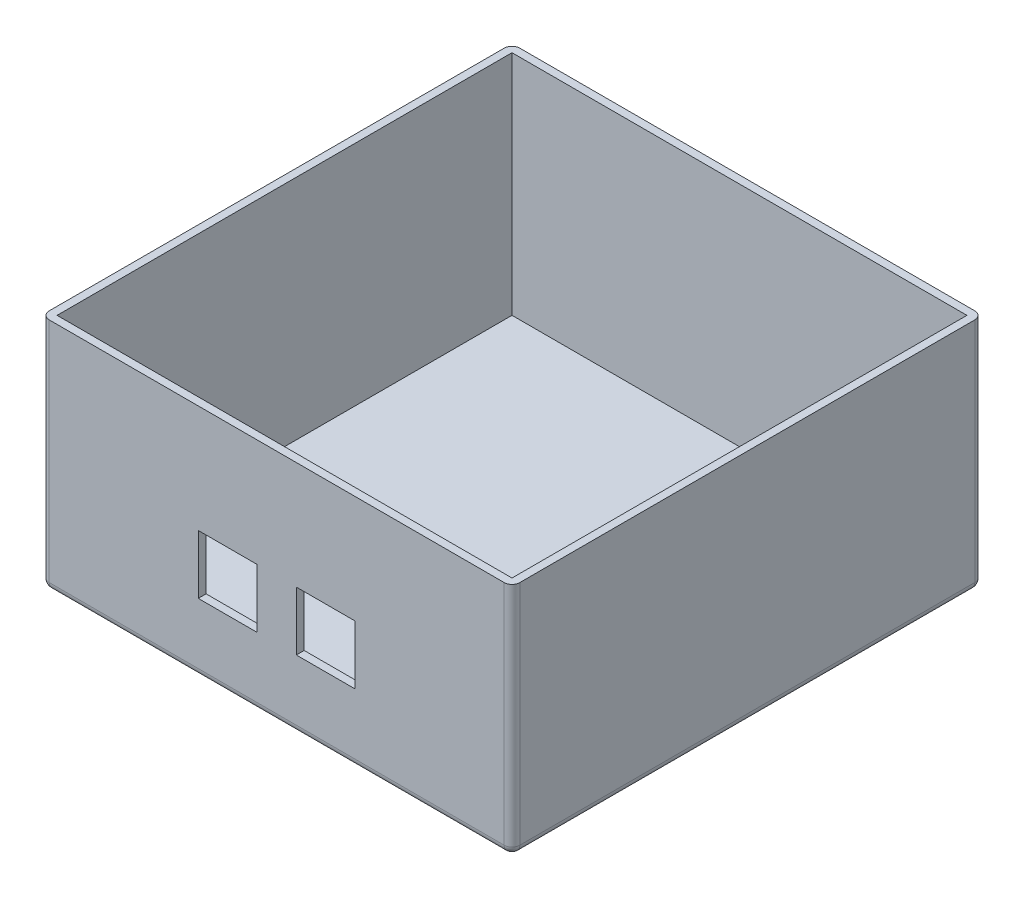
ISO-10303-21;
HEADER;
FILE_DESCRIPTION(('STEP AP214'),'2;1');
FILE_NAME('part.step','',(''),(''),'','','');
FILE_SCHEMA(('AUTOMOTIVE_DESIGN { 1 0 10303 214 1 1 1 1 }'));
ENDSEC;
DATA;
#1=APPLICATION_CONTEXT('core data for automotive mechanical design processes');
#2=APPLICATION_PROTOCOL_DEFINITION('international standard','automotive_design',2000,#1);
#3=PRODUCT_CONTEXT('',#1,'mechanical');
#4=PRODUCT('Part','Part','',(#3));
#5=PRODUCT_RELATED_PRODUCT_CATEGORY('part','',(#4));
#6=PRODUCT_DEFINITION_FORMATION('','',#4);
#7=PRODUCT_DEFINITION_CONTEXT('part definition',#1,'design');
#8=PRODUCT_DEFINITION('design','',#6,#7);
#9=PRODUCT_DEFINITION_SHAPE('','',#8);
#10=(LENGTH_UNIT() NAMED_UNIT(*) SI_UNIT(.MILLI.,.METRE.));
#11=(NAMED_UNIT(*) PLANE_ANGLE_UNIT() SI_UNIT($,.RADIAN.));
#12=(NAMED_UNIT(*) SI_UNIT($,.STERADIAN.) SOLID_ANGLE_UNIT());
#13=UNCERTAINTY_MEASURE_WITH_UNIT(LENGTH_MEASURE(1.E-05),#10,'distance_accuracy_value','');
#14=(GEOMETRIC_REPRESENTATION_CONTEXT(3) GLOBAL_UNCERTAINTY_ASSIGNED_CONTEXT((#13)) GLOBAL_UNIT_ASSIGNED_CONTEXT((#10,
#11,#12)) REPRESENTATION_CONTEXT('',''));
#15=CARTESIAN_POINT('',(0.,0.,0.));
#16=DIRECTION('',(0.,0.,1.));
#17=DIRECTION('',(1.,0.,0.));
#18=AXIS2_PLACEMENT_3D('',#15,#16,#17);
#19=CARTESIAN_POINT('',(0.,60.,0.));
#20=DIRECTION('',(0.,-1.,0.));
#21=DIRECTION('',(0.,0.,-1.));
#22=AXIS2_PLACEMENT_3D('',#19,#20,#21);
#23=PLANE('',#22);
#24=DIRECTION('',(-1.,0.,0.));
#25=VECTOR('',#24,1.);
#26=CARTESIAN_POINT('',(-60.,60.,-60.));
#27=LINE('',#26,#25);
#28=CARTESIAN_POINT('',(58.,60.,-60.));
#29=VERTEX_POINT('',#28);
#30=CARTESIAN_POINT('',(-58.,60.,-60.));
#31=VERTEX_POINT('',#30);
#32=EDGE_CURVE('E293',#29,#31,#27,.T.);
#33=ORIENTED_EDGE('',*,*,#32,.T.);
#34=CARTESIAN_POINT('',(-58.,60.,-58.));
#35=DIRECTION('',(0.,-1.,0.));
#36=DIRECTION('',(0.,0.,-1.));
#37=AXIS2_PLACEMENT_3D('',#34,#35,#36);
#38=CIRCLE('',#37,2.);
#39=CARTESIAN_POINT('',(-60.,60.,-58.));
#40=VERTEX_POINT('',#39);
#41=EDGE_CURVE('E11',#31,#40,#38,.F.);
#42=ORIENTED_EDGE('',*,*,#41,.T.);
#43=DIRECTION('',(0.,0.,1.));
#44=VECTOR('',#43,1.);
#45=CARTESIAN_POINT('',(-60.,60.,60.));
#46=LINE('',#45,#44);
#47=CARTESIAN_POINT('',(-60.,60.,58.));
#48=VERTEX_POINT('',#47);
#49=EDGE_CURVE('E296',#40,#48,#46,.T.);
#50=ORIENTED_EDGE('',*,*,#49,.T.);
#51=CARTESIAN_POINT('',(-58.,60.,58.));
#52=DIRECTION('',(0.,-1.,0.));
#53=DIRECTION('',(0.,0.,-1.));
#54=AXIS2_PLACEMENT_3D('',#51,#52,#53);
#55=CIRCLE('',#54,2.);
#56=CARTESIAN_POINT('',(-58.,60.,60.));
#57=VERTEX_POINT('',#56);
#58=EDGE_CURVE('E336',#48,#57,#55,.F.);
#59=ORIENTED_EDGE('',*,*,#58,.T.);
#60=DIRECTION('',(1.,0.,0.));
#61=VECTOR('',#60,1.);
#62=CARTESIAN_POINT('',(-60.,60.,60.));
#63=LINE('',#62,#61);
#64=CARTESIAN_POINT('',(58.,60.,60.));
#65=VERTEX_POINT('',#64);
#66=EDGE_CURVE('E299',#57,#65,#63,.T.);
#67=ORIENTED_EDGE('',*,*,#66,.T.);
#68=CARTESIAN_POINT('',(58.,60.,58.));
#69=DIRECTION('',(0.,-1.,0.));
#70=DIRECTION('',(0.,0.,-1.));
#71=AXIS2_PLACEMENT_3D('',#68,#69,#70);
#72=CIRCLE('',#71,2.);
#73=CARTESIAN_POINT('',(60.,60.,58.));
#74=VERTEX_POINT('',#73);
#75=EDGE_CURVE('E338',#65,#74,#72,.F.);
#76=ORIENTED_EDGE('',*,*,#75,.T.);
#77=DIRECTION('',(0.,0.,-1.));
#78=VECTOR('',#77,1.);
#79=CARTESIAN_POINT('',(60.,60.,60.));
#80=LINE('',#79,#78);
#81=CARTESIAN_POINT('',(60.,60.,-58.));
#82=VERTEX_POINT('',#81);
#83=EDGE_CURVE('E267',#74,#82,#80,.T.);
#84=ORIENTED_EDGE('',*,*,#83,.T.);
#85=CARTESIAN_POINT('',(58.,60.,-58.));
#86=DIRECTION('',(0.,-1.,0.));
#87=DIRECTION('',(0.,0.,-1.));
#88=AXIS2_PLACEMENT_3D('',#85,#86,#87);
#89=CIRCLE('',#88,2.);
#90=EDGE_CURVE('E48',#82,#29,#89,.F.);
#91=ORIENTED_EDGE('',*,*,#90,.T.);
#92=EDGE_LOOP('',(#33,#42,#50,#59,#67,#76,#84,#91));
#93=FACE_BOUND('',#92,.T.);
#94=DIRECTION('',(0.,0.,-1.));
#95=VECTOR('',#94,1.);
#96=CARTESIAN_POINT('',(58.,60.,0.));
#97=LINE('',#96,#95);
#98=CARTESIAN_POINT('',(58.,60.,58.));
#99=VERTEX_POINT('',#98);
#100=CARTESIAN_POINT('',(58.,60.,-58.));
#101=VERTEX_POINT('',#100);
#102=EDGE_CURVE('E283',#99,#101,#97,.T.);
#103=ORIENTED_EDGE('',*,*,#102,.F.);
#104=DIRECTION('',(1.,0.,0.));
#105=VECTOR('',#104,1.);
#106=CARTESIAN_POINT('',(0.,60.,58.));
#107=LINE('',#106,#105);
#108=CARTESIAN_POINT('',(-58.,60.,58.));
#109=VERTEX_POINT('',#108);
#110=EDGE_CURVE('E273',#109,#99,#107,.T.);
#111=ORIENTED_EDGE('',*,*,#110,.F.);
#112=DIRECTION('',(0.,0.,1.));
#113=VECTOR('',#112,1.);
#114=CARTESIAN_POINT('',(-58.,60.,0.));
#115=LINE('',#114,#113);
#116=CARTESIAN_POINT('',(-58.,60.,-58.));
#117=VERTEX_POINT('',#116);
#118=EDGE_CURVE('E287',#117,#109,#115,.T.);
#119=ORIENTED_EDGE('',*,*,#118,.F.);
#120=DIRECTION('',(-1.,0.,0.));
#121=VECTOR('',#120,1.);
#122=CARTESIAN_POINT('',(0.,60.,-58.));
#123=LINE('',#122,#121);
#124=EDGE_CURVE('E285',#101,#117,#123,.T.);
#125=ORIENTED_EDGE('',*,*,#124,.F.);
#126=EDGE_LOOP('',(#103,#111,#119,#125));
#127=FACE_BOUND('',#126,.T.);
#128=ADVANCED_FACE('F39',(#93,#127),#23,.F.);
#129=CARTESIAN_POINT('',(60.,60.,60.));
#130=DIRECTION('',(-1.,0.,0.));
#131=DIRECTION('',(0.,0.,1.));
#132=AXIS2_PLACEMENT_3D('',#129,#130,#131);
#133=PLANE('',#132);
#134=DIRECTION('',(0.,0.,-1.));
#135=VECTOR('',#134,1.);
#136=CARTESIAN_POINT('',(60.,2.,-60.));
#137=LINE('',#136,#135);
#138=CARTESIAN_POINT('',(60.,2.,58.));
#139=VERTEX_POINT('',#138);
#140=CARTESIAN_POINT('',(60.,2.,-58.));
#141=VERTEX_POINT('',#140);
#142=EDGE_CURVE('E320',#139,#141,#137,.T.);
#143=ORIENTED_EDGE('',*,*,#142,.T.);
#144=DIRECTION('',(0.,-1.,0.));
#145=VECTOR('',#144,1.);
#146=CARTESIAN_POINT('',(60.,60.,-58.));
#147=LINE('',#146,#145);
#148=EDGE_CURVE('E322',#141,#82,#147,.F.);
#149=ORIENTED_EDGE('',*,*,#148,.T.);
#150=ORIENTED_EDGE('',*,*,#83,.F.);
#151=DIRECTION('',(0.,-1.,0.));
#152=VECTOR('',#151,1.);
#153=CARTESIAN_POINT('',(60.,60.,58.));
#154=LINE('',#153,#152);
#155=EDGE_CURVE('E318',#74,#139,#154,.T.);
#156=ORIENTED_EDGE('',*,*,#155,.T.);
#157=EDGE_LOOP('',(#143,#149,#150,#156));
#158=FACE_BOUND('',#157,.T.);
#159=ADVANCED_FACE('F385',(#158),#133,.F.);
#160=CARTESIAN_POINT('',(-60.,60.,-60.));
#161=DIRECTION('',(0.,0.,1.));
#162=DIRECTION('',(1.,0.,0.));
#163=AXIS2_PLACEMENT_3D('',#160,#161,#162);
#164=PLANE('',#163);
#165=DIRECTION('',(-1.,0.,0.));
#166=VECTOR('',#165,1.);
#167=CARTESIAN_POINT('',(-60.,2.,-60.));
#168=LINE('',#167,#166);
#169=CARTESIAN_POINT('',(58.,2.,-60.));
#170=VERTEX_POINT('',#169);
#171=CARTESIAN_POINT('',(-58.,2.,-60.));
#172=VERTEX_POINT('',#171);
#173=EDGE_CURVE('E304',#170,#172,#168,.T.);
#174=ORIENTED_EDGE('',*,*,#173,.T.);
#175=DIRECTION('',(0.,-1.,0.));
#176=VECTOR('',#175,1.);
#177=CARTESIAN_POINT('',(-58.,60.,-60.));
#178=LINE('',#177,#176);
#179=EDGE_CURVE('E307',#172,#31,#178,.F.);
#180=ORIENTED_EDGE('',*,*,#179,.T.);
#181=ORIENTED_EDGE('',*,*,#32,.F.);
#182=DIRECTION('',(0.,-1.,0.));
#183=VECTOR('',#182,1.);
#184=CARTESIAN_POINT('',(58.,60.,-60.));
#185=LINE('',#184,#183);
#186=EDGE_CURVE('E302',#29,#170,#185,.T.);
#187=ORIENTED_EDGE('',*,*,#186,.T.);
#188=EDGE_LOOP('',(#174,#180,#181,#187));
#189=FACE_BOUND('',#188,.T.);
#190=ADVANCED_FACE('F399',(#189),#164,.F.);
#191=CARTESIAN_POINT('',(-60.,60.,60.));
#192=DIRECTION('',(1.,0.,0.));
#193=DIRECTION('',(0.,0.,-1.));
#194=AXIS2_PLACEMENT_3D('',#191,#192,#193);
#195=PLANE('',#194);
#196=ORIENTED_EDGE('',*,*,#49,.F.);
#197=DIRECTION('',(0.,-1.,0.));
#198=VECTOR('',#197,1.);
#199=CARTESIAN_POINT('',(-60.,60.,-58.));
#200=LINE('',#199,#198);
#201=CARTESIAN_POINT('',(-60.,2.,-58.));
#202=VERTEX_POINT('',#201);
#203=EDGE_CURVE('E334',#40,#202,#200,.T.);
#204=ORIENTED_EDGE('',*,*,#203,.T.);
#205=DIRECTION('',(0.,0.,1.));
#206=VECTOR('',#205,1.);
#207=CARTESIAN_POINT('',(-60.,2.,60.));
#208=LINE('',#207,#206);
#209=CARTESIAN_POINT('',(-60.,2.,58.));
#210=VERTEX_POINT('',#209);
#211=EDGE_CURVE('E332',#202,#210,#208,.T.);
#212=ORIENTED_EDGE('',*,*,#211,.T.);
#213=DIRECTION('',(0.,-1.,0.));
#214=VECTOR('',#213,1.);
#215=CARTESIAN_POINT('',(-60.,60.,58.));
#216=LINE('',#215,#214);
#217=EDGE_CURVE('E330',#210,#48,#216,.F.);
#218=ORIENTED_EDGE('',*,*,#217,.T.);
#219=EDGE_LOOP('',(#196,#204,#212,#218));
#220=FACE_BOUND('',#219,.T.);
#221=ADVANCED_FACE('F409',(#220),#195,.F.);
#222=CARTESIAN_POINT('',(-60.,60.,60.));
#223=DIRECTION('',(0.,0.,-1.));
#224=DIRECTION('',(-1.,0.,0.));
#225=AXIS2_PLACEMENT_3D('',#222,#223,#224);
#226=PLANE('',#225);
#227=DIRECTION('',(0.,-1.,0.));
#228=VECTOR('',#227,1.);
#229=CARTESIAN_POINT('',(-20.,17.5,60.));
#230=LINE('',#229,#228);
#231=CARTESIAN_POINT('',(-20.,32.5,60.));
#232=VERTEX_POINT('',#231);
#233=CARTESIAN_POINT('',(-20.,17.5,60.));
#234=VERTEX_POINT('',#233);
#235=EDGE_CURVE('E205',#232,#234,#230,.T.);
#236=ORIENTED_EDGE('',*,*,#235,.F.);
#237=DIRECTION('',(-1.,0.,0.));
#238=VECTOR('',#237,1.);
#239=CARTESIAN_POINT('',(-20.,32.5,60.));
#240=LINE('',#239,#238);
#241=CARTESIAN_POINT('',(-5.,32.5,60.));
#242=VERTEX_POINT('',#241);
#243=EDGE_CURVE('E223',#242,#232,#240,.T.);
#244=ORIENTED_EDGE('',*,*,#243,.F.);
#245=DIRECTION('',(0.,1.,0.));
#246=VECTOR('',#245,1.);
#247=CARTESIAN_POINT('',(-5.,17.5,60.));
#248=LINE('',#247,#246);
#249=CARTESIAN_POINT('',(-5.,17.5,60.));
#250=VERTEX_POINT('',#249);
#251=EDGE_CURVE('E220',#250,#242,#248,.T.);
#252=ORIENTED_EDGE('',*,*,#251,.F.);
#253=DIRECTION('',(1.,0.,0.));
#254=VECTOR('',#253,1.);
#255=CARTESIAN_POINT('',(-20.,17.5,60.));
#256=LINE('',#255,#254);
#257=EDGE_CURVE('E56',#234,#250,#256,.T.);
#258=ORIENTED_EDGE('',*,*,#257,.F.);
#259=EDGE_LOOP('',(#236,#244,#252,#258));
#260=FACE_BOUND('',#259,.T.);
#261=DIRECTION('',(0.,-1.,0.));
#262=VECTOR('',#261,1.);
#263=CARTESIAN_POINT('',(5.,17.5,60.));
#264=LINE('',#263,#262);
#265=CARTESIAN_POINT('',(5.,32.5,60.));
#266=VERTEX_POINT('',#265);
#267=CARTESIAN_POINT('',(5.,17.5,60.));
#268=VERTEX_POINT('',#267);
#269=EDGE_CURVE('E246',#266,#268,#264,.T.);
#270=ORIENTED_EDGE('',*,*,#269,.F.);
#271=DIRECTION('',(-1.,0.,0.));
#272=VECTOR('',#271,1.);
#273=CARTESIAN_POINT('',(5.,32.5,60.));
#274=LINE('',#273,#272);
#275=CARTESIAN_POINT('',(20.,32.5,60.));
#276=VERTEX_POINT('',#275);
#277=EDGE_CURVE('E249',#276,#266,#274,.T.);
#278=ORIENTED_EDGE('',*,*,#277,.F.);
#279=DIRECTION('',(0.,1.,0.));
#280=VECTOR('',#279,1.);
#281=CARTESIAN_POINT('',(20.,17.5,60.));
#282=LINE('',#281,#280);
#283=CARTESIAN_POINT('',(20.,17.5,60.));
#284=VERTEX_POINT('',#283);
#285=EDGE_CURVE('E252',#284,#276,#282,.T.);
#286=ORIENTED_EDGE('',*,*,#285,.F.);
#287=DIRECTION('',(1.,0.,0.));
#288=VECTOR('',#287,1.);
#289=CARTESIAN_POINT('',(5.,17.5,60.));
#290=LINE('',#289,#288);
#291=EDGE_CURVE('E64',#268,#284,#290,.T.);
#292=ORIENTED_EDGE('',*,*,#291,.F.);
#293=EDGE_LOOP('',(#270,#278,#286,#292));
#294=FACE_BOUND('',#293,.T.);
#295=DIRECTION('',(1.,0.,0.));
#296=VECTOR('',#295,1.);
#297=CARTESIAN_POINT('',(60.,2.,60.));
#298=LINE('',#297,#296);
#299=CARTESIAN_POINT('',(-58.,2.,60.));
#300=VERTEX_POINT('',#299);
#301=CARTESIAN_POINT('',(58.,2.,60.));
#302=VERTEX_POINT('',#301);
#303=EDGE_CURVE('E326',#300,#302,#298,.T.);
#304=ORIENTED_EDGE('',*,*,#303,.T.);
#305=DIRECTION('',(0.,-1.,0.));
#306=VECTOR('',#305,1.);
#307=CARTESIAN_POINT('',(58.,60.,60.));
#308=LINE('',#307,#306);
#309=EDGE_CURVE('E328',#302,#65,#308,.F.);
#310=ORIENTED_EDGE('',*,*,#309,.T.);
#311=ORIENTED_EDGE('',*,*,#66,.F.);
#312=DIRECTION('',(0.,-1.,0.));
#313=VECTOR('',#312,1.);
#314=CARTESIAN_POINT('',(-58.,60.,60.));
#315=LINE('',#314,#313);
#316=EDGE_CURVE('E324',#57,#300,#315,.T.);
#317=ORIENTED_EDGE('',*,*,#316,.T.);
#318=EDGE_LOOP('',(#304,#310,#311,#317));
#319=FACE_BOUND('',#318,.T.);
#320=ADVANCED_FACE('F430',(#260,#294,#319),#226,.F.);
#321=CARTESIAN_POINT('',(0.,0.,0.));
#322=DIRECTION('',(0.,-1.,0.));
#323=DIRECTION('',(0.,0.,-1.));
#324=AXIS2_PLACEMENT_3D('',#321,#322,#323);
#325=PLANE('',#324);
#326=DIRECTION('',(0.,0.,1.));
#327=VECTOR('',#326,1.);
#328=CARTESIAN_POINT('',(-58.,0.,-60.));
#329=LINE('',#328,#327);
#330=CARTESIAN_POINT('',(-58.,0.,58.));
#331=VERTEX_POINT('',#330);
#332=CARTESIAN_POINT('',(-58.,0.,-58.));
#333=VERTEX_POINT('',#332);
#334=EDGE_CURVE('E309',#331,#333,#329,.F.);
#335=ORIENTED_EDGE('',*,*,#334,.T.);
#336=DIRECTION('',(-1.,0.,0.));
#337=VECTOR('',#336,1.);
#338=CARTESIAN_POINT('',(60.,0.,-58.));
#339=LINE('',#338,#337);
#340=CARTESIAN_POINT('',(58.,0.,-58.));
#341=VERTEX_POINT('',#340);
#342=EDGE_CURVE('E315',#333,#341,#339,.F.);
#343=ORIENTED_EDGE('',*,*,#342,.T.);
#344=DIRECTION('',(0.,0.,-1.));
#345=VECTOR('',#344,1.);
#346=CARTESIAN_POINT('',(58.,0.,60.));
#347=LINE('',#346,#345);
#348=CARTESIAN_POINT('',(58.,0.,58.));
#349=VERTEX_POINT('',#348);
#350=EDGE_CURVE('E313',#341,#349,#347,.F.);
#351=ORIENTED_EDGE('',*,*,#350,.T.);
#352=DIRECTION('',(1.,0.,0.));
#353=VECTOR('',#352,1.);
#354=CARTESIAN_POINT('',(-60.,0.,58.));
#355=LINE('',#354,#353);
#356=EDGE_CURVE('E311',#349,#331,#355,.F.);
#357=ORIENTED_EDGE('',*,*,#356,.T.);
#358=EDGE_LOOP('',(#335,#343,#351,#357));
#359=FACE_BOUND('',#358,.T.);
#360=ADVANCED_FACE('F426',(#359),#325,.T.);
#361=CARTESIAN_POINT('',(58.,60.,60.));
#362=DIRECTION('',(-1.,0.,0.));
#363=DIRECTION('',(0.,0.,1.));
#364=AXIS2_PLACEMENT_3D('',#361,#362,#363);
#365=PLANE('',#364);
#366=DIRECTION('',(0.,0.,-1.));
#367=VECTOR('',#366,1.);
#368=CARTESIAN_POINT('',(58.,2.,0.));
#369=LINE('',#368,#367);
#370=CARTESIAN_POINT('',(58.,2.,58.));
#371=VERTEX_POINT('',#370);
#372=CARTESIAN_POINT('',(58.,2.,-58.));
#373=VERTEX_POINT('',#372);
#374=EDGE_CURVE('E260',#371,#373,#369,.T.);
#375=ORIENTED_EDGE('',*,*,#374,.F.);
#376=DIRECTION('',(0.,-1.,0.));
#377=VECTOR('',#376,1.);
#378=CARTESIAN_POINT('',(58.,60.,58.));
#379=LINE('',#378,#377);
#380=EDGE_CURVE('E269',#99,#371,#379,.T.);
#381=ORIENTED_EDGE('',*,*,#380,.F.);
#382=ORIENTED_EDGE('',*,*,#102,.T.);
#383=DIRECTION('',(0.,-1.,0.));
#384=VECTOR('',#383,1.);
#385=CARTESIAN_POINT('',(58.,60.,-58.));
#386=LINE('',#385,#384);
#387=EDGE_CURVE('E264',#101,#373,#386,.T.);
#388=ORIENTED_EDGE('',*,*,#387,.T.);
#389=EDGE_LOOP('',(#375,#381,#382,#388));
#390=FACE_BOUND('',#389,.T.);
#391=ADVANCED_FACE('F452',(#390),#365,.T.);
#392=CARTESIAN_POINT('',(-60.,60.,-58.));
#393=DIRECTION('',(0.,0.,1.));
#394=DIRECTION('',(1.,0.,0.));
#395=AXIS2_PLACEMENT_3D('',#392,#393,#394);
#396=PLANE('',#395);
#397=DIRECTION('',(-1.,0.,0.));
#398=VECTOR('',#397,1.);
#399=CARTESIAN_POINT('',(0.,2.,-58.));
#400=LINE('',#399,#398);
#401=CARTESIAN_POINT('',(-58.,2.,-58.));
#402=VERTEX_POINT('',#401);
#403=EDGE_CURVE('E263',#373,#402,#400,.T.);
#404=ORIENTED_EDGE('',*,*,#403,.F.);
#405=ORIENTED_EDGE('',*,*,#387,.F.);
#406=ORIENTED_EDGE('',*,*,#124,.T.);
#407=DIRECTION('',(0.,-1.,0.));
#408=VECTOR('',#407,1.);
#409=CARTESIAN_POINT('',(-58.,60.,-58.));
#410=LINE('',#409,#408);
#411=EDGE_CURVE('E268',#117,#402,#410,.T.);
#412=ORIENTED_EDGE('',*,*,#411,.T.);
#413=EDGE_LOOP('',(#404,#405,#406,#412));
#414=FACE_BOUND('',#413,.T.);
#415=ADVANCED_FACE('F655',(#414),#396,.T.);
#416=CARTESIAN_POINT('',(-58.,60.,60.));
#417=DIRECTION('',(1.,0.,0.));
#418=DIRECTION('',(0.,0.,-1.));
#419=AXIS2_PLACEMENT_3D('',#416,#417,#418);
#420=PLANE('',#419);
#421=DIRECTION('',(0.,0.,1.));
#422=VECTOR('',#421,1.);
#423=CARTESIAN_POINT('',(-58.,2.,0.));
#424=LINE('',#423,#422);
#425=CARTESIAN_POINT('',(-58.,2.,58.));
#426=VERTEX_POINT('',#425);
#427=EDGE_CURVE('E275',#402,#426,#424,.T.);
#428=ORIENTED_EDGE('',*,*,#427,.F.);
#429=ORIENTED_EDGE('',*,*,#411,.F.);
#430=ORIENTED_EDGE('',*,*,#118,.T.);
#431=DIRECTION('',(0.,-1.,0.));
#432=VECTOR('',#431,1.);
#433=CARTESIAN_POINT('',(-58.,60.,58.));
#434=LINE('',#433,#432);
#435=EDGE_CURVE('E272',#109,#426,#434,.T.);
#436=ORIENTED_EDGE('',*,*,#435,.T.);
#437=EDGE_LOOP('',(#428,#429,#430,#436));
#438=FACE_BOUND('',#437,.T.);
#439=ADVANCED_FACE('F550',(#438),#420,.T.);
#440=CARTESIAN_POINT('',(-60.,60.,58.));
#441=DIRECTION('',(0.,0.,-1.));
#442=DIRECTION('',(-1.,0.,0.));
#443=AXIS2_PLACEMENT_3D('',#440,#441,#442);
#444=PLANE('',#443);
#445=DIRECTION('',(-1.,0.,0.));
#446=VECTOR('',#445,1.);
#447=CARTESIAN_POINT('',(-20.,32.5,58.));
#448=LINE('',#447,#446);
#449=CARTESIAN_POINT('',(-5.,32.5,58.));
#450=VERTEX_POINT('',#449);
#451=CARTESIAN_POINT('',(-20.,32.5,58.));
#452=VERTEX_POINT('',#451);
#453=EDGE_CURVE('E212',#450,#452,#448,.T.);
#454=ORIENTED_EDGE('',*,*,#453,.T.);
#455=DIRECTION('',(0.,-1.,0.));
#456=VECTOR('',#455,1.);
#457=CARTESIAN_POINT('',(-20.,17.5,58.));
#458=LINE('',#457,#456);
#459=CARTESIAN_POINT('',(-20.,17.5,58.));
#460=VERTEX_POINT('',#459);
#461=EDGE_CURVE('E199',#452,#460,#458,.T.);
#462=ORIENTED_EDGE('',*,*,#461,.T.);
#463=DIRECTION('',(1.,0.,0.));
#464=VECTOR('',#463,1.);
#465=CARTESIAN_POINT('',(-20.,17.5,58.));
#466=LINE('',#465,#464);
#467=CARTESIAN_POINT('',(-5.,17.5,58.));
#468=VERTEX_POINT('',#467);
#469=EDGE_CURVE('E189',#460,#468,#466,.T.);
#470=ORIENTED_EDGE('',*,*,#469,.T.);
#471=DIRECTION('',(0.,1.,0.));
#472=VECTOR('',#471,1.);
#473=CARTESIAN_POINT('',(-5.,17.5,58.));
#474=LINE('',#473,#472);
#475=EDGE_CURVE('E198',#468,#450,#474,.T.);
#476=ORIENTED_EDGE('',*,*,#475,.T.);
#477=EDGE_LOOP('',(#454,#462,#470,#476));
#478=FACE_BOUND('',#477,.T.);
#479=DIRECTION('',(-1.,0.,0.));
#480=VECTOR('',#479,1.);
#481=CARTESIAN_POINT('',(5.,32.5,58.));
#482=LINE('',#481,#480);
#483=CARTESIAN_POINT('',(20.,32.5,58.));
#484=VERTEX_POINT('',#483);
#485=CARTESIAN_POINT('',(5.,32.5,58.));
#486=VERTEX_POINT('',#485);
#487=EDGE_CURVE('E234',#484,#486,#482,.T.);
#488=ORIENTED_EDGE('',*,*,#487,.T.);
#489=DIRECTION('',(0.,-1.,0.));
#490=VECTOR('',#489,1.);
#491=CARTESIAN_POINT('',(5.,17.5,58.));
#492=LINE('',#491,#490);
#493=CARTESIAN_POINT('',(5.,17.5,58.));
#494=VERTEX_POINT('',#493);
#495=EDGE_CURVE('E213',#486,#494,#492,.T.);
#496=ORIENTED_EDGE('',*,*,#495,.T.);
#497=DIRECTION('',(1.,0.,0.));
#498=VECTOR('',#497,1.);
#499=CARTESIAN_POINT('',(5.,17.5,58.));
#500=LINE('',#499,#498);
#501=CARTESIAN_POINT('',(20.,17.5,58.));
#502=VERTEX_POINT('',#501);
#503=EDGE_CURVE('E216',#494,#502,#500,.T.);
#504=ORIENTED_EDGE('',*,*,#503,.T.);
#505=DIRECTION('',(0.,1.,0.));
#506=VECTOR('',#505,1.);
#507=CARTESIAN_POINT('',(20.,17.5,58.));
#508=LINE('',#507,#506);
#509=EDGE_CURVE('E255',#502,#484,#508,.T.);
#510=ORIENTED_EDGE('',*,*,#509,.T.);
#511=EDGE_LOOP('',(#488,#496,#504,#510));
#512=FACE_BOUND('',#511,.T.);
#513=DIRECTION('',(1.,0.,0.));
#514=VECTOR('',#513,1.);
#515=CARTESIAN_POINT('',(0.,2.,58.));
#516=LINE('',#515,#514);
#517=EDGE_CURVE('E279',#426,#371,#516,.T.);
#518=ORIENTED_EDGE('',*,*,#517,.F.);
#519=ORIENTED_EDGE('',*,*,#435,.F.);
#520=ORIENTED_EDGE('',*,*,#110,.T.);
#521=ORIENTED_EDGE('',*,*,#380,.T.);
#522=EDGE_LOOP('',(#518,#519,#520,#521));
#523=FACE_BOUND('',#522,.T.);
#524=ADVANCED_FACE('F209',(#478,#512,#523),#444,.T.);
#525=CARTESIAN_POINT('',(0.,2.,0.));
#526=DIRECTION('',(0.,-1.,0.));
#527=DIRECTION('',(0.,0.,-1.));
#528=AXIS2_PLACEMENT_3D('',#525,#526,#527);
#529=PLANE('',#528);
#530=ORIENTED_EDGE('',*,*,#374,.T.);
#531=ORIENTED_EDGE('',*,*,#403,.T.);
#532=ORIENTED_EDGE('',*,*,#427,.T.);
#533=ORIENTED_EDGE('',*,*,#517,.T.);
#534=EDGE_LOOP('',(#530,#531,#532,#533));
#535=FACE_BOUND('',#534,.T.);
#536=ADVANCED_FACE('F435',(#535),#529,.F.);
#537=CARTESIAN_POINT('',(58.,60.,58.));
#538=DIRECTION('',(0.,-1.,0.));
#539=DIRECTION('',(0.,0.,-1.));
#540=AXIS2_PLACEMENT_3D('',#537,#538,#539);
#541=CYLINDRICAL_SURFACE('',#540,2.);
#542=ORIENTED_EDGE('',*,*,#75,.F.);
#543=ORIENTED_EDGE('',*,*,#309,.F.);
#544=CARTESIAN_POINT('',(58.,2.,58.));
#545=DIRECTION('',(0.,-1.,0.));
#546=DIRECTION('',(0.,0.,-1.));
#547=AXIS2_PLACEMENT_3D('',#544,#545,#546);
#548=CIRCLE('',#547,2.);
#549=EDGE_CURVE('E367',#139,#302,#548,.T.);
#550=ORIENTED_EDGE('',*,*,#549,.F.);
#551=ORIENTED_EDGE('',*,*,#155,.F.);
#552=EDGE_LOOP('',(#542,#543,#550,#551));
#553=FACE_BOUND('',#552,.T.);
#554=ADVANCED_FACE('F41',(#553),#541,.T.);
#555=CARTESIAN_POINT('',(-58.,60.,58.));
#556=DIRECTION('',(0.,-1.,0.));
#557=DIRECTION('',(0.,0.,-1.));
#558=AXIS2_PLACEMENT_3D('',#555,#556,#557);
#559=CYLINDRICAL_SURFACE('',#558,2.);
#560=ORIENTED_EDGE('',*,*,#58,.F.);
#561=ORIENTED_EDGE('',*,*,#217,.F.);
#562=CARTESIAN_POINT('',(-58.,2.,58.));
#563=DIRECTION('',(0.,-1.,0.));
#564=DIRECTION('',(0.,0.,-1.));
#565=AXIS2_PLACEMENT_3D('',#562,#563,#564);
#566=CIRCLE('',#565,2.);
#567=EDGE_CURVE('E365',#300,#210,#566,.T.);
#568=ORIENTED_EDGE('',*,*,#567,.F.);
#569=ORIENTED_EDGE('',*,*,#316,.F.);
#570=EDGE_LOOP('',(#560,#561,#568,#569));
#571=FACE_BOUND('',#570,.T.);
#572=ADVANCED_FACE('F414',(#571),#559,.T.);
#573=CARTESIAN_POINT('',(-60.,2.,58.));
#574=DIRECTION('',(-1.,0.,0.));
#575=DIRECTION('',(0.,0.,1.));
#576=AXIS2_PLACEMENT_3D('',#573,#574,#575);
#577=CYLINDRICAL_SURFACE('',#576,2.);
#578=CARTESIAN_POINT('',(58.,2.,58.));
#579=DIRECTION('',(1.,0.,0.));
#580=DIRECTION('',(0.,0.,-1.));
#581=AXIS2_PLACEMENT_3D('',#578,#579,#580);
#582=CIRCLE('',#581,2.);
#583=EDGE_CURVE('E43',#302,#349,#582,.T.);
#584=ORIENTED_EDGE('',*,*,#583,.F.);
#585=ORIENTED_EDGE('',*,*,#303,.F.);
#586=CARTESIAN_POINT('',(-58.,2.,58.));
#587=DIRECTION('',(-1.,0.,0.));
#588=DIRECTION('',(0.,0.,1.));
#589=AXIS2_PLACEMENT_3D('',#586,#587,#588);
#590=CIRCLE('',#589,2.);
#591=EDGE_CURVE('E362',#331,#300,#590,.T.);
#592=ORIENTED_EDGE('',*,*,#591,.F.);
#593=ORIENTED_EDGE('',*,*,#356,.F.);
#594=EDGE_LOOP('',(#584,#585,#592,#593));
#595=FACE_BOUND('',#594,.T.);
#596=ADVANCED_FACE('F427',(#595),#577,.T.);
#597=CARTESIAN_POINT('',(58.,2.,58.));
#598=DIRECTION('',(0.,0.,1.));
#599=DIRECTION('',(0.,-1.,0.));
#600=AXIS2_PLACEMENT_3D('',#597,#598,#599);
#601=SPHERICAL_SURFACE('',#600,2.);
#602=ORIENTED_EDGE('',*,*,#549,.T.);
#603=ORIENTED_EDGE('',*,*,#583,.T.);
#604=CARTESIAN_POINT('',(58.,2.,58.));
#605=DIRECTION('',(0.,0.,1.));
#606=DIRECTION('',(1.,0.,0.));
#607=AXIS2_PLACEMENT_3D('',#604,#605,#606);
#608=CIRCLE('',#607,2.);
#609=EDGE_CURVE('E359',#139,#349,#608,.F.);
#610=ORIENTED_EDGE('',*,*,#609,.F.);
#611=EDGE_LOOP('',(#602,#603,#610));
#612=FACE_BOUND('',#611,.T.);
#613=ADVANCED_FACE('F374',(#612),#601,.T.);
#614=CARTESIAN_POINT('',(-58.,2.,58.));
#615=DIRECTION('',(0.,0.,1.));
#616=DIRECTION('',(0.,-1.,0.));
#617=AXIS2_PLACEMENT_3D('',#614,#615,#616);
#618=SPHERICAL_SURFACE('',#617,2.);
#619=ORIENTED_EDGE('',*,*,#591,.T.);
#620=ORIENTED_EDGE('',*,*,#567,.T.);
#621=CARTESIAN_POINT('',(-58.,2.,58.));
#622=DIRECTION('',(0.,0.,1.));
#623=DIRECTION('',(1.,0.,0.));
#624=AXIS2_PLACEMENT_3D('',#621,#622,#623);
#625=CIRCLE('',#624,2.);
#626=EDGE_CURVE('E356',#331,#210,#625,.F.);
#627=ORIENTED_EDGE('',*,*,#626,.F.);
#628=EDGE_LOOP('',(#619,#620,#627));
#629=FACE_BOUND('',#628,.T.);
#630=ADVANCED_FACE('F418',(#629),#618,.T.);
#631=CARTESIAN_POINT('',(58.,2.,60.));
#632=DIRECTION('',(0.,0.,1.));
#633=DIRECTION('',(1.,0.,0.));
#634=AXIS2_PLACEMENT_3D('',#631,#632,#633);
#635=CYLINDRICAL_SURFACE('',#634,2.);
#636=ORIENTED_EDGE('',*,*,#609,.T.);
#637=ORIENTED_EDGE('',*,*,#350,.F.);
#638=CARTESIAN_POINT('',(58.,2.,-58.));
#639=DIRECTION('',(0.,0.,-1.));
#640=DIRECTION('',(-1.,0.,0.));
#641=AXIS2_PLACEMENT_3D('',#638,#639,#640);
#642=CIRCLE('',#641,2.);
#643=EDGE_CURVE('E353',#141,#341,#642,.T.);
#644=ORIENTED_EDGE('',*,*,#643,.F.);
#645=ORIENTED_EDGE('',*,*,#142,.F.);
#646=EDGE_LOOP('',(#636,#637,#644,#645));
#647=FACE_BOUND('',#646,.T.);
#648=ADVANCED_FACE('F381',(#647),#635,.T.);
#649=CARTESIAN_POINT('',(58.,60.,-58.));
#650=DIRECTION('',(0.,-1.,0.));
#651=DIRECTION('',(0.,0.,-1.));
#652=AXIS2_PLACEMENT_3D('',#649,#650,#651);
#653=CYLINDRICAL_SURFACE('',#652,2.);
#654=ORIENTED_EDGE('',*,*,#90,.F.);
#655=ORIENTED_EDGE('',*,*,#148,.F.);
#656=CARTESIAN_POINT('',(58.,2.,-58.));
#657=DIRECTION('',(0.,-1.,0.));
#658=DIRECTION('',(0.,0.,-1.));
#659=AXIS2_PLACEMENT_3D('',#656,#657,#658);
#660=CIRCLE('',#659,2.);
#661=EDGE_CURVE('E350',#170,#141,#660,.T.);
#662=ORIENTED_EDGE('',*,*,#661,.F.);
#663=ORIENTED_EDGE('',*,*,#186,.F.);
#664=EDGE_LOOP('',(#654,#655,#662,#663));
#665=FACE_BOUND('',#664,.T.);
#666=ADVANCED_FACE('F391',(#665),#653,.T.);
#667=CARTESIAN_POINT('',(-58.,60.,-58.));
#668=DIRECTION('',(0.,-1.,0.));
#669=DIRECTION('',(0.,0.,-1.));
#670=AXIS2_PLACEMENT_3D('',#667,#668,#669);
#671=CYLINDRICAL_SURFACE('',#670,2.);
#672=ORIENTED_EDGE('',*,*,#41,.F.);
#673=ORIENTED_EDGE('',*,*,#179,.F.);
#674=CARTESIAN_POINT('',(-58.,2.,-58.));
#675=DIRECTION('',(0.,-1.,0.));
#676=DIRECTION('',(0.,0.,-1.));
#677=AXIS2_PLACEMENT_3D('',#674,#675,#676);
#678=CIRCLE('',#677,2.);
#679=EDGE_CURVE('E347',#202,#172,#678,.T.);
#680=ORIENTED_EDGE('',*,*,#679,.F.);
#681=ORIENTED_EDGE('',*,*,#203,.F.);
#682=EDGE_LOOP('',(#672,#673,#680,#681));
#683=FACE_BOUND('',#682,.T.);
#684=ADVANCED_FACE('F404',(#683),#671,.T.);
#685=CARTESIAN_POINT('',(-58.,2.,60.));
#686=DIRECTION('',(0.,0.,-1.));
#687=DIRECTION('',(-1.,0.,0.));
#688=AXIS2_PLACEMENT_3D('',#685,#686,#687);
#689=CYLINDRICAL_SURFACE('',#688,2.);
#690=ORIENTED_EDGE('',*,*,#626,.T.);
#691=ORIENTED_EDGE('',*,*,#211,.F.);
#692=CARTESIAN_POINT('',(-58.,2.,-58.));
#693=DIRECTION('',(0.,0.,-1.));
#694=DIRECTION('',(-1.,0.,0.));
#695=AXIS2_PLACEMENT_3D('',#692,#693,#694);
#696=CIRCLE('',#695,2.);
#697=EDGE_CURVE('E344',#333,#202,#696,.T.);
#698=ORIENTED_EDGE('',*,*,#697,.F.);
#699=ORIENTED_EDGE('',*,*,#334,.F.);
#700=EDGE_LOOP('',(#690,#691,#698,#699));
#701=FACE_BOUND('',#700,.T.);
#702=ADVANCED_FACE('F422',(#701),#689,.T.);
#703=CARTESIAN_POINT('',(58.,2.,-58.));
#704=DIRECTION('',(1.,0.,0.));
#705=DIRECTION('',(0.,1.,0.));
#706=AXIS2_PLACEMENT_3D('',#703,#704,#705);
#707=SPHERICAL_SURFACE('',#706,2.);
#708=ORIENTED_EDGE('',*,*,#661,.T.);
#709=ORIENTED_EDGE('',*,*,#643,.T.);
#710=CARTESIAN_POINT('',(58.,2.,-58.));
#711=DIRECTION('',(1.,0.,0.));
#712=DIRECTION('',(0.,0.,-1.));
#713=AXIS2_PLACEMENT_3D('',#710,#711,#712);
#714=CIRCLE('',#713,2.);
#715=EDGE_CURVE('E342',#170,#341,#714,.F.);
#716=ORIENTED_EDGE('',*,*,#715,.F.);
#717=EDGE_LOOP('',(#708,#709,#716));
#718=FACE_BOUND('',#717,.T.);
#719=ADVANCED_FACE('F468',(#718),#707,.T.);
#720=CARTESIAN_POINT('',(-58.,2.,-58.));
#721=DIRECTION('',(-1.,0.,0.));
#722=DIRECTION('',(0.,-1.,0.));
#723=AXIS2_PLACEMENT_3D('',#720,#721,#722);
#724=SPHERICAL_SURFACE('',#723,2.);
#725=ORIENTED_EDGE('',*,*,#697,.T.);
#726=ORIENTED_EDGE('',*,*,#679,.T.);
#727=CARTESIAN_POINT('',(-58.,2.,-58.));
#728=DIRECTION('',(-1.,0.,0.));
#729=DIRECTION('',(0.,0.,1.));
#730=AXIS2_PLACEMENT_3D('',#727,#728,#729);
#731=CIRCLE('',#730,2.);
#732=EDGE_CURVE('E233',#333,#172,#731,.F.);
#733=ORIENTED_EDGE('',*,*,#732,.F.);
#734=EDGE_LOOP('',(#725,#726,#733));
#735=FACE_BOUND('',#734,.T.);
#736=ADVANCED_FACE('F464',(#735),#724,.T.);
#737=CARTESIAN_POINT('',(-60.,2.,-58.));
#738=DIRECTION('',(1.,0.,0.));
#739=DIRECTION('',(0.,0.,-1.));
#740=AXIS2_PLACEMENT_3D('',#737,#738,#739);
#741=CYLINDRICAL_SURFACE('',#740,2.);
#742=ORIENTED_EDGE('',*,*,#715,.T.);
#743=ORIENTED_EDGE('',*,*,#342,.F.);
#744=ORIENTED_EDGE('',*,*,#732,.T.);
#745=ORIENTED_EDGE('',*,*,#173,.F.);
#746=EDGE_LOOP('',(#742,#743,#744,#745));
#747=FACE_BOUND('',#746,.T.);
#748=ADVANCED_FACE('F460',(#747),#741,.T.);
#749=CARTESIAN_POINT('',(5.,32.5,-60.001));
#750=DIRECTION('',(0.,1.,0.));
#751=DIRECTION('',(-1.,0.,0.));
#752=AXIS2_PLACEMENT_3D('',#749,#750,#751);
#753=PLANE('',#752);
#754=DIRECTION('',(0.,0.,1.));
#755=VECTOR('',#754,1.);
#756=CARTESIAN_POINT('',(20.,32.5,-60.001));
#757=LINE('',#756,#755);
#758=EDGE_CURVE('E238',#484,#276,#757,.T.);
#759=ORIENTED_EDGE('',*,*,#758,.T.);
#760=ORIENTED_EDGE('',*,*,#277,.T.);
#761=DIRECTION('',(0.,0.,1.));
#762=VECTOR('',#761,1.);
#763=CARTESIAN_POINT('',(5.,32.5,-60.001));
#764=LINE('',#763,#762);
#765=EDGE_CURVE('E240',#486,#266,#764,.T.);
#766=ORIENTED_EDGE('',*,*,#765,.F.);
#767=ORIENTED_EDGE('',*,*,#487,.F.);
#768=EDGE_LOOP('',(#759,#760,#766,#767));
#769=FACE_BOUND('',#768,.T.);
#770=ADVANCED_FACE('F463',(#769),#753,.F.);
#771=CARTESIAN_POINT('',(5.,17.5,-60.001));
#772=DIRECTION('',(-1.,0.,0.));
#773=DIRECTION('',(0.,-1.,0.));
#774=AXIS2_PLACEMENT_3D('',#771,#772,#773);
#775=PLANE('',#774);
#776=ORIENTED_EDGE('',*,*,#765,.T.);
#777=ORIENTED_EDGE('',*,*,#269,.T.);
#778=DIRECTION('',(0.,0.,1.));
#779=VECTOR('',#778,1.);
#780=CARTESIAN_POINT('',(5.,17.5,-60.001));
#781=LINE('',#780,#779);
#782=EDGE_CURVE('E242',#494,#268,#781,.T.);
#783=ORIENTED_EDGE('',*,*,#782,.F.);
#784=ORIENTED_EDGE('',*,*,#495,.F.);
#785=EDGE_LOOP('',(#776,#777,#783,#784));
#786=FACE_BOUND('',#785,.T.);
#787=ADVANCED_FACE('F558',(#786),#775,.F.);
#788=CARTESIAN_POINT('',(5.,17.5,-60.001));
#789=DIRECTION('',(0.,-1.,0.));
#790=DIRECTION('',(1.,0.,0.));
#791=AXIS2_PLACEMENT_3D('',#788,#789,#790);
#792=PLANE('',#791);
#793=ORIENTED_EDGE('',*,*,#782,.T.);
#794=ORIENTED_EDGE('',*,*,#291,.T.);
#795=DIRECTION('',(0.,0.,1.));
#796=VECTOR('',#795,1.);
#797=CARTESIAN_POINT('',(20.,17.5,-60.001));
#798=LINE('',#797,#796);
#799=EDGE_CURVE('E237',#502,#284,#798,.T.);
#800=ORIENTED_EDGE('',*,*,#799,.F.);
#801=ORIENTED_EDGE('',*,*,#503,.F.);
#802=EDGE_LOOP('',(#793,#794,#800,#801));
#803=FACE_BOUND('',#802,.T.);
#804=ADVANCED_FACE('F567',(#803),#792,.F.);
#805=CARTESIAN_POINT('',(20.,17.5,-60.001));
#806=DIRECTION('',(1.,0.,0.));
#807=DIRECTION('',(0.,0.,-1.));
#808=AXIS2_PLACEMENT_3D('',#805,#806,#807);
#809=PLANE('',#808);
#810=ORIENTED_EDGE('',*,*,#799,.T.);
#811=ORIENTED_EDGE('',*,*,#285,.T.);
#812=ORIENTED_EDGE('',*,*,#758,.F.);
#813=ORIENTED_EDGE('',*,*,#509,.F.);
#814=EDGE_LOOP('',(#810,#811,#812,#813));
#815=FACE_BOUND('',#814,.T.);
#816=ADVANCED_FACE('F576',(#815),#809,.F.);
#817=CARTESIAN_POINT('',(-20.,32.5,-60.001));
#818=DIRECTION('',(0.,1.,0.));
#819=DIRECTION('',(-1.,0.,0.));
#820=AXIS2_PLACEMENT_3D('',#817,#818,#819);
#821=PLANE('',#820);
#822=DIRECTION('',(0.,0.,1.));
#823=VECTOR('',#822,1.);
#824=CARTESIAN_POINT('',(-5.,32.5,-60.001));
#825=LINE('',#824,#823);
#826=EDGE_CURVE('E228',#450,#242,#825,.T.);
#827=ORIENTED_EDGE('',*,*,#826,.T.);
#828=ORIENTED_EDGE('',*,*,#243,.T.);
#829=DIRECTION('',(0.,0.,1.));
#830=VECTOR('',#829,1.);
#831=CARTESIAN_POINT('',(-20.,32.5,-60.001));
#832=LINE('',#831,#830);
#833=EDGE_CURVE('E206',#452,#232,#832,.T.);
#834=ORIENTED_EDGE('',*,*,#833,.F.);
#835=ORIENTED_EDGE('',*,*,#453,.F.);
#836=EDGE_LOOP('',(#827,#828,#834,#835));
#837=FACE_BOUND('',#836,.T.);
#838=ADVANCED_FACE('F584',(#837),#821,.F.);
#839=CARTESIAN_POINT('',(-20.,17.5,-60.001));
#840=DIRECTION('',(-1.,0.,0.));
#841=DIRECTION('',(0.,0.,1.));
#842=AXIS2_PLACEMENT_3D('',#839,#840,#841);
#843=PLANE('',#842);
#844=ORIENTED_EDGE('',*,*,#833,.T.);
#845=ORIENTED_EDGE('',*,*,#235,.T.);
#846=DIRECTION('',(0.,0.,1.));
#847=VECTOR('',#846,1.);
#848=CARTESIAN_POINT('',(-20.,17.5,-60.001));
#849=LINE('',#848,#847);
#850=EDGE_CURVE('E192',#460,#234,#849,.T.);
#851=ORIENTED_EDGE('',*,*,#850,.F.);
#852=ORIENTED_EDGE('',*,*,#461,.F.);
#853=EDGE_LOOP('',(#844,#845,#851,#852));
#854=FACE_BOUND('',#853,.T.);
#855=ADVANCED_FACE('F202',(#854),#843,.F.);
#856=CARTESIAN_POINT('',(-20.,17.5,-60.001));
#857=DIRECTION('',(0.,-1.,0.));
#858=DIRECTION('',(1.,0.,0.));
#859=AXIS2_PLACEMENT_3D('',#856,#857,#858);
#860=PLANE('',#859);
#861=ORIENTED_EDGE('',*,*,#850,.T.);
#862=ORIENTED_EDGE('',*,*,#257,.T.);
#863=DIRECTION('',(0.,0.,1.));
#864=VECTOR('',#863,1.);
#865=CARTESIAN_POINT('',(-5.,17.5,-60.001));
#866=LINE('',#865,#864);
#867=EDGE_CURVE('E194',#468,#250,#866,.T.);
#868=ORIENTED_EDGE('',*,*,#867,.F.);
#869=ORIENTED_EDGE('',*,*,#469,.F.);
#870=EDGE_LOOP('',(#861,#862,#868,#869));
#871=FACE_BOUND('',#870,.T.);
#872=ADVANCED_FACE('F191',(#871),#860,.F.);
#873=CARTESIAN_POINT('',(-5.,17.5,-60.001));
#874=DIRECTION('',(1.,0.,0.));
#875=DIRECTION('',(0.,0.,-1.));
#876=AXIS2_PLACEMENT_3D('',#873,#874,#875);
#877=PLANE('',#876);
#878=ORIENTED_EDGE('',*,*,#867,.T.);
#879=ORIENTED_EDGE('',*,*,#251,.T.);
#880=ORIENTED_EDGE('',*,*,#826,.F.);
#881=ORIENTED_EDGE('',*,*,#475,.F.);
#882=EDGE_LOOP('',(#878,#879,#880,#881));
#883=FACE_BOUND('',#882,.T.);
#884=ADVANCED_FACE('F608',(#883),#877,.F.);
#885=CLOSED_SHELL('',(#128,#159,#190,#221,#320,#360,#391,#415,#439,#524,#536,#554,#572,#596,
#613,#630,#648,#666,#684,#702,#719,#736,#748,#770,#787,#804,#816,#838,#855,#872,#884));
#886=MANIFOLD_SOLID_BREP('B2',#885);
#887=ADVANCED_BREP_SHAPE_REPRESENTATION('',(#18,#886),#14);
#888=SHAPE_DEFINITION_REPRESENTATION(#9,#887);
ENDSEC;
END-ISO-10303-21;
